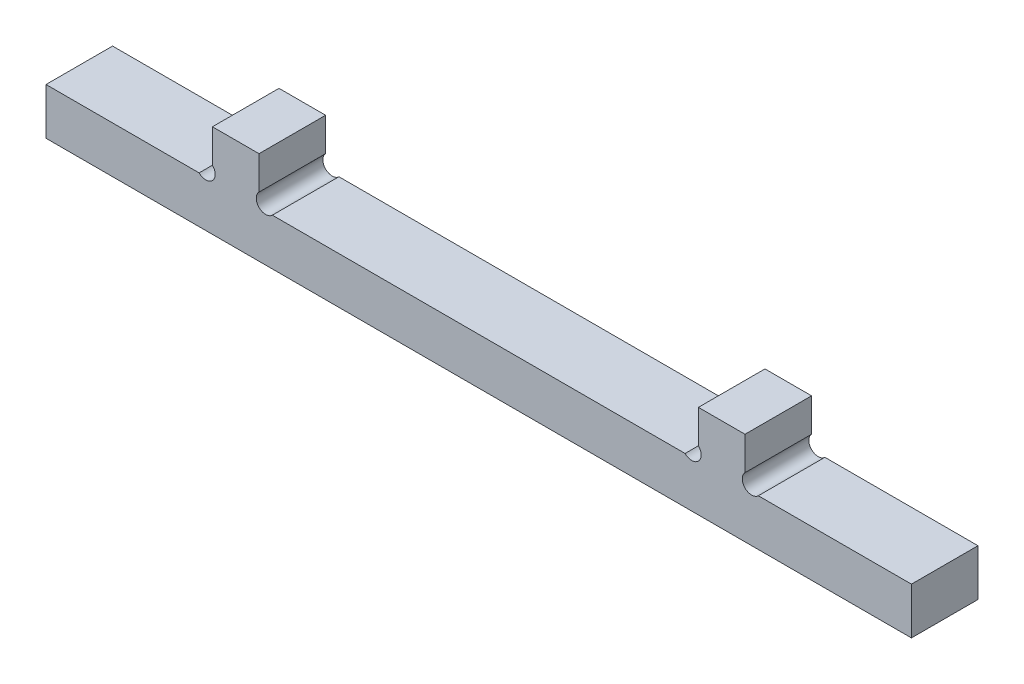
ISO-10303-21;
HEADER;
FILE_DESCRIPTION(('STEP AP214'),'2;1');
FILE_NAME('part.step','',(''),(''),'','','');
FILE_SCHEMA(('AUTOMOTIVE_DESIGN { 1 0 10303 214 1 1 1 1 }'));
ENDSEC;
DATA;
#1=APPLICATION_CONTEXT('core data for automotive mechanical design processes');
#2=APPLICATION_PROTOCOL_DEFINITION('international standard','automotive_design',2000,#1);
#3=PRODUCT_CONTEXT('',#1,'mechanical');
#4=PRODUCT('Part','Part','',(#3));
#5=PRODUCT_RELATED_PRODUCT_CATEGORY('part','',(#4));
#6=PRODUCT_DEFINITION_FORMATION('','',#4);
#7=PRODUCT_DEFINITION_CONTEXT('part definition',#1,'design');
#8=PRODUCT_DEFINITION('design','',#6,#7);
#9=PRODUCT_DEFINITION_SHAPE('','',#8);
#10=(LENGTH_UNIT() NAMED_UNIT(*) SI_UNIT(.MILLI.,.METRE.));
#11=(NAMED_UNIT(*) PLANE_ANGLE_UNIT() SI_UNIT($,.RADIAN.));
#12=(NAMED_UNIT(*) SI_UNIT($,.STERADIAN.) SOLID_ANGLE_UNIT());
#13=UNCERTAINTY_MEASURE_WITH_UNIT(LENGTH_MEASURE(1.E-05),#10,'distance_accuracy_value','');
#14=(GEOMETRIC_REPRESENTATION_CONTEXT(3) GLOBAL_UNCERTAINTY_ASSIGNED_CONTEXT((#13)) GLOBAL_UNIT_ASSIGNED_CONTEXT((#10,
#11,#12)) REPRESENTATION_CONTEXT('',''));
#15=CARTESIAN_POINT('',(0.,0.,0.));
#16=DIRECTION('',(0.,0.,1.));
#17=DIRECTION('',(1.,0.,0.));
#18=AXIS2_PLACEMENT_3D('',#15,#16,#17);
#19=CARTESIAN_POINT('',(52.0699999999999,5.71499999999943,12.7));
#20=DIRECTION('',(0.,0.,-1.));
#21=DIRECTION('',(-1.,0.,0.));
#22=AXIS2_PLACEMENT_3D('',#19,#20,#21);
#23=CYLINDRICAL_SURFACE('',#22,1.79605122421382);
#24=CARTESIAN_POINT('',(52.0699999999999,5.71499999999943,0.));
#25=DIRECTION('',(0.,0.,1.));
#26=DIRECTION('',(1.,0.,0.));
#27=AXIS2_PLACEMENT_3D('',#24,#25,#26);
#28=CIRCLE('',#27,1.79605122421382);
#29=CARTESIAN_POINT('',(50.8,6.98499999999947,0.));
#30=VERTEX_POINT('',#29);
#31=CARTESIAN_POINT('',(53.3400000000005,4.445,0.));
#32=VERTEX_POINT('',#31);
#33=EDGE_CURVE('E195',#30,#32,#28,.T.);
#34=ORIENTED_EDGE('',*,*,#33,.F.);
#35=DIRECTION('',(0.,0.,-1.));
#36=VECTOR('',#35,1.);
#37=CARTESIAN_POINT('',(50.8,6.98499999999947,12.7));
#38=LINE('',#37,#36);
#39=CARTESIAN_POINT('',(50.8,6.98499999999947,12.7));
#40=VERTEX_POINT('',#39);
#41=EDGE_CURVE('E11',#40,#30,#38,.T.);
#42=ORIENTED_EDGE('',*,*,#41,.F.);
#43=CARTESIAN_POINT('',(52.0699999999999,5.71499999999943,12.7));
#44=DIRECTION('',(0.,0.,1.));
#45=DIRECTION('',(1.,0.,0.));
#46=AXIS2_PLACEMENT_3D('',#43,#44,#45);
#47=CIRCLE('',#46,1.79605122421382);
#48=CARTESIAN_POINT('',(53.3400000000005,4.445,12.7));
#49=VERTEX_POINT('',#48);
#50=EDGE_CURVE('E351',#40,#49,#47,.T.);
#51=ORIENTED_EDGE('',*,*,#50,.T.);
#52=DIRECTION('',(0.,0.,-1.));
#53=VECTOR('',#52,1.);
#54=CARTESIAN_POINT('',(53.3400000000005,4.445,12.7));
#55=LINE('',#54,#53);
#56=EDGE_CURVE('E62',#49,#32,#55,.T.);
#57=ORIENTED_EDGE('',*,*,#56,.T.);
#58=EDGE_LOOP('',(#34,#42,#51,#57));
#59=FACE_BOUND('',#58,.T.);
#60=ADVANCED_FACE('F45',(#59),#23,.F.);
#61=CARTESIAN_POINT('',(50.8,0.,12.7));
#62=DIRECTION('',(-1.,0.,0.));
#63=DIRECTION('',(0.,0.,1.));
#64=AXIS2_PLACEMENT_3D('',#61,#62,#63);
#65=PLANE('',#64);
#66=DIRECTION('',(0.,1.,0.));
#67=VECTOR('',#66,1.);
#68=CARTESIAN_POINT('',(50.8,0.,0.));
#69=LINE('',#68,#67);
#70=CARTESIAN_POINT('',(50.8,13.335,0.));
#71=VERTEX_POINT('',#70);
#72=EDGE_CURVE('E198',#30,#71,#69,.T.);
#73=ORIENTED_EDGE('',*,*,#72,.T.);
#74=DIRECTION('',(0.,0.,-1.));
#75=VECTOR('',#74,1.);
#76=CARTESIAN_POINT('',(50.8,13.335,12.7));
#77=LINE('',#76,#75);
#78=CARTESIAN_POINT('',(50.8,13.335,12.7));
#79=VERTEX_POINT('',#78);
#80=EDGE_CURVE('E54',#79,#71,#77,.T.);
#81=ORIENTED_EDGE('',*,*,#80,.F.);
#82=DIRECTION('',(0.,1.,0.));
#83=VECTOR('',#82,1.);
#84=CARTESIAN_POINT('',(50.8,0.,12.7));
#85=LINE('',#84,#83);
#86=EDGE_CURVE('E309',#40,#79,#85,.T.);
#87=ORIENTED_EDGE('',*,*,#86,.F.);
#88=ORIENTED_EDGE('',*,*,#41,.T.);
#89=EDGE_LOOP('',(#73,#81,#87,#88));
#90=FACE_BOUND('',#89,.T.);
#91=ADVANCED_FACE('F355',(#90),#65,.F.);
#92=CARTESIAN_POINT('',(0.,13.335,12.7));
#93=DIRECTION('',(0.,-1.,0.));
#94=DIRECTION('',(1.,0.,0.));
#95=AXIS2_PLACEMENT_3D('',#92,#93,#94);
#96=PLANE('',#95);
#97=DIRECTION('',(-1.,0.,0.));
#98=VECTOR('',#97,1.);
#99=CARTESIAN_POINT('',(0.,13.335,0.));
#100=LINE('',#99,#98);
#101=CARTESIAN_POINT('',(41.91,13.335,0.));
#102=VERTEX_POINT('',#101);
#103=EDGE_CURVE('E201',#71,#102,#100,.T.);
#104=ORIENTED_EDGE('',*,*,#103,.T.);
#105=DIRECTION('',(0.,0.,-1.));
#106=VECTOR('',#105,1.);
#107=CARTESIAN_POINT('',(41.91,13.335,12.7));
#108=LINE('',#107,#106);
#109=CARTESIAN_POINT('',(41.91,13.335,12.7));
#110=VERTEX_POINT('',#109);
#111=EDGE_CURVE('E280',#110,#102,#108,.T.);
#112=ORIENTED_EDGE('',*,*,#111,.F.);
#113=DIRECTION('',(-1.,0.,0.));
#114=VECTOR('',#113,1.);
#115=CARTESIAN_POINT('',(0.,13.335,12.7));
#116=LINE('',#115,#114);
#117=EDGE_CURVE('E290',#79,#110,#116,.T.);
#118=ORIENTED_EDGE('',*,*,#117,.F.);
#119=ORIENTED_EDGE('',*,*,#80,.T.);
#120=EDGE_LOOP('',(#104,#112,#118,#119));
#121=FACE_BOUND('',#120,.T.);
#122=ADVANCED_FACE('F288',(#121),#96,.F.);
#123=CARTESIAN_POINT('',(41.91,0.,12.7));
#124=DIRECTION('',(-1.,0.,0.));
#125=DIRECTION('',(0.,0.,1.));
#126=AXIS2_PLACEMENT_3D('',#123,#124,#125);
#127=PLANE('',#126);
#128=DIRECTION('',(0.,1.,0.));
#129=VECTOR('',#128,1.);
#130=CARTESIAN_POINT('',(41.91,0.,0.));
#131=LINE('',#130,#129);
#132=CARTESIAN_POINT('',(41.91,6.98499999999953,0.));
#133=VERTEX_POINT('',#132);
#134=EDGE_CURVE('E205',#133,#102,#131,.T.);
#135=ORIENTED_EDGE('',*,*,#134,.F.);
#136=DIRECTION('',(0.,0.,-1.));
#137=VECTOR('',#136,1.);
#138=CARTESIAN_POINT('',(41.91,6.98499999999953,12.7));
#139=LINE('',#138,#137);
#140=CARTESIAN_POINT('',(41.91,6.98499999999953,12.7));
#141=VERTEX_POINT('',#140);
#142=EDGE_CURVE('E277',#141,#133,#139,.T.);
#143=ORIENTED_EDGE('',*,*,#142,.F.);
#144=DIRECTION('',(0.,1.,0.));
#145=VECTOR('',#144,1.);
#146=CARTESIAN_POINT('',(41.91,0.,12.7));
#147=LINE('',#146,#145);
#148=EDGE_CURVE('E302',#141,#110,#147,.T.);
#149=ORIENTED_EDGE('',*,*,#148,.T.);
#150=ORIENTED_EDGE('',*,*,#111,.T.);
#151=EDGE_LOOP('',(#135,#143,#149,#150));
#152=FACE_BOUND('',#151,.T.);
#153=ADVANCED_FACE('F298',(#152),#127,.T.);
#154=CARTESIAN_POINT('',(40.64,5.71499999999956,12.7));
#155=DIRECTION('',(0.,0.,-1.));
#156=DIRECTION('',(-1.,0.,0.));
#157=AXIS2_PLACEMENT_3D('',#154,#155,#156);
#158=CYLINDRICAL_SURFACE('',#157,1.79605122421383);
#159=CARTESIAN_POINT('',(40.64,5.71499999999956,0.));
#160=DIRECTION('',(0.,0.,1.));
#161=DIRECTION('',(1.,0.,0.));
#162=AXIS2_PLACEMENT_3D('',#159,#160,#161);
#163=CIRCLE('',#162,1.79605122421383);
#164=CARTESIAN_POINT('',(39.3699999999995,4.445,0.));
#165=VERTEX_POINT('',#164);
#166=EDGE_CURVE('E209',#133,#165,#163,.F.);
#167=ORIENTED_EDGE('',*,*,#166,.T.);
#168=DIRECTION('',(0.,0.,-1.));
#169=VECTOR('',#168,1.);
#170=CARTESIAN_POINT('',(39.3699999999995,4.445,12.7));
#171=LINE('',#170,#169);
#172=CARTESIAN_POINT('',(39.3699999999995,4.445,12.7));
#173=VERTEX_POINT('',#172);
#174=EDGE_CURVE('E274',#173,#165,#171,.T.);
#175=ORIENTED_EDGE('',*,*,#174,.F.);
#176=CARTESIAN_POINT('',(40.64,5.71499999999956,12.7));
#177=DIRECTION('',(0.,0.,1.));
#178=DIRECTION('',(1.,0.,0.));
#179=AXIS2_PLACEMENT_3D('',#176,#177,#178);
#180=CIRCLE('',#179,1.79605122421383);
#181=EDGE_CURVE('E304',#141,#173,#180,.F.);
#182=ORIENTED_EDGE('',*,*,#181,.F.);
#183=ORIENTED_EDGE('',*,*,#142,.T.);
#184=EDGE_LOOP('',(#167,#175,#182,#183));
#185=FACE_BOUND('',#184,.T.);
#186=ADVANCED_FACE('F365',(#185),#158,.F.);
#187=CARTESIAN_POINT('',(0.,4.445,12.7));
#188=DIRECTION('',(0.,1.,0.));
#189=DIRECTION('',(0.,0.,1.));
#190=AXIS2_PLACEMENT_3D('',#187,#188,#189);
#191=PLANE('',#190);
#192=DIRECTION('',(1.,0.,0.));
#193=VECTOR('',#192,1.);
#194=CARTESIAN_POINT('',(0.,4.445,0.));
#195=LINE('',#194,#193);
#196=CARTESIAN_POINT('',(-39.37,4.445,0.));
#197=VERTEX_POINT('',#196);
#198=EDGE_CURVE('E213',#197,#165,#195,.T.);
#199=ORIENTED_EDGE('',*,*,#198,.F.);
#200=DIRECTION('',(0.,0.,-1.));
#201=VECTOR('',#200,1.);
#202=CARTESIAN_POINT('',(-39.37,4.445,12.7));
#203=LINE('',#202,#201);
#204=CARTESIAN_POINT('',(-39.37,4.445,12.7));
#205=VERTEX_POINT('',#204);
#206=EDGE_CURVE('E271',#205,#197,#203,.T.);
#207=ORIENTED_EDGE('',*,*,#206,.F.);
#208=DIRECTION('',(1.,0.,0.));
#209=VECTOR('',#208,1.);
#210=CARTESIAN_POINT('',(0.,4.445,12.7));
#211=LINE('',#210,#209);
#212=EDGE_CURVE('E192',#205,#173,#211,.T.);
#213=ORIENTED_EDGE('',*,*,#212,.T.);
#214=ORIENTED_EDGE('',*,*,#174,.T.);
#215=EDGE_LOOP('',(#199,#207,#213,#214));
#216=FACE_BOUND('',#215,.T.);
#217=ADVANCED_FACE('F368',(#216),#191,.T.);
#218=CARTESIAN_POINT('',(-40.64,5.715,12.7));
#219=DIRECTION('',(0.,0.,-1.));
#220=DIRECTION('',(-1.,0.,0.));
#221=AXIS2_PLACEMENT_3D('',#218,#219,#220);
#222=CYLINDRICAL_SURFACE('',#221,1.79605122421383);
#223=CARTESIAN_POINT('',(-40.64,5.715,0.));
#224=DIRECTION('',(0.,0.,1.));
#225=DIRECTION('',(1.,0.,0.));
#226=AXIS2_PLACEMENT_3D('',#223,#224,#225);
#227=CIRCLE('',#226,1.79605122421383);
#228=CARTESIAN_POINT('',(-41.91,6.98500000000001,0.));
#229=VERTEX_POINT('',#228);
#230=EDGE_CURVE('E217',#229,#197,#227,.T.);
#231=ORIENTED_EDGE('',*,*,#230,.F.);
#232=DIRECTION('',(0.,0.,-1.));
#233=VECTOR('',#232,1.);
#234=CARTESIAN_POINT('',(-41.91,6.98500000000001,12.7));
#235=LINE('',#234,#233);
#236=CARTESIAN_POINT('',(-41.91,6.98500000000001,12.7));
#237=VERTEX_POINT('',#236);
#238=EDGE_CURVE('E268',#237,#229,#235,.T.);
#239=ORIENTED_EDGE('',*,*,#238,.F.);
#240=CARTESIAN_POINT('',(-40.64,5.715,12.7));
#241=DIRECTION('',(0.,0.,1.));
#242=DIRECTION('',(1.,0.,0.));
#243=AXIS2_PLACEMENT_3D('',#240,#241,#242);
#244=CIRCLE('',#243,1.79605122421383);
#245=EDGE_CURVE('E315',#237,#205,#244,.T.);
#246=ORIENTED_EDGE('',*,*,#245,.T.);
#247=ORIENTED_EDGE('',*,*,#206,.T.);
#248=EDGE_LOOP('',(#231,#239,#246,#247));
#249=FACE_BOUND('',#248,.T.);
#250=ADVANCED_FACE('F370',(#249),#222,.F.);
#251=CARTESIAN_POINT('',(-41.91,0.,12.7));
#252=DIRECTION('',(-1.,0.,0.));
#253=DIRECTION('',(0.,0.,1.));
#254=AXIS2_PLACEMENT_3D('',#251,#252,#253);
#255=PLANE('',#254);
#256=DIRECTION('',(0.,1.,0.));
#257=VECTOR('',#256,1.);
#258=CARTESIAN_POINT('',(-41.91,0.,0.));
#259=LINE('',#258,#257);
#260=CARTESIAN_POINT('',(-41.91,13.335,0.));
#261=VERTEX_POINT('',#260);
#262=EDGE_CURVE('E223',#229,#261,#259,.T.);
#263=ORIENTED_EDGE('',*,*,#262,.T.);
#264=DIRECTION('',(0.,0.,-1.));
#265=VECTOR('',#264,1.);
#266=CARTESIAN_POINT('',(-41.91,13.335,12.7));
#267=LINE('',#266,#265);
#268=CARTESIAN_POINT('',(-41.91,13.335,12.7));
#269=VERTEX_POINT('',#268);
#270=EDGE_CURVE('E265',#269,#261,#267,.T.);
#271=ORIENTED_EDGE('',*,*,#270,.F.);
#272=DIRECTION('',(0.,1.,0.));
#273=VECTOR('',#272,1.);
#274=CARTESIAN_POINT('',(-41.91,0.,12.7));
#275=LINE('',#274,#273);
#276=EDGE_CURVE('E319',#237,#269,#275,.T.);
#277=ORIENTED_EDGE('',*,*,#276,.F.);
#278=ORIENTED_EDGE('',*,*,#238,.T.);
#279=EDGE_LOOP('',(#263,#271,#277,#278));
#280=FACE_BOUND('',#279,.T.);
#281=ADVANCED_FACE('F373',(#280),#255,.F.);
#282=CARTESIAN_POINT('',(0.,13.335,12.7));
#283=DIRECTION('',(0.,1.,0.));
#284=DIRECTION('',(-1.,0.,0.));
#285=AXIS2_PLACEMENT_3D('',#282,#283,#284);
#286=PLANE('',#285);
#287=DIRECTION('',(1.,0.,0.));
#288=VECTOR('',#287,1.);
#289=CARTESIAN_POINT('',(0.,13.335,0.));
#290=LINE('',#289,#288);
#291=CARTESIAN_POINT('',(-50.8,13.335,0.));
#292=VERTEX_POINT('',#291);
#293=EDGE_CURVE('E227',#292,#261,#290,.T.);
#294=ORIENTED_EDGE('',*,*,#293,.F.);
#295=DIRECTION('',(0.,0.,-1.));
#296=VECTOR('',#295,1.);
#297=CARTESIAN_POINT('',(-50.8,13.335,12.7));
#298=LINE('',#297,#296);
#299=CARTESIAN_POINT('',(-50.8,13.335,12.7));
#300=VERTEX_POINT('',#299);
#301=EDGE_CURVE('E262',#300,#292,#298,.T.);
#302=ORIENTED_EDGE('',*,*,#301,.F.);
#303=DIRECTION('',(1.,0.,0.));
#304=VECTOR('',#303,1.);
#305=CARTESIAN_POINT('',(0.,13.335,12.7));
#306=LINE('',#305,#304);
#307=EDGE_CURVE('E322',#300,#269,#306,.T.);
#308=ORIENTED_EDGE('',*,*,#307,.T.);
#309=ORIENTED_EDGE('',*,*,#270,.T.);
#310=EDGE_LOOP('',(#294,#302,#308,#309));
#311=FACE_BOUND('',#310,.T.);
#312=ADVANCED_FACE('F377',(#311),#286,.T.);
#313=CARTESIAN_POINT('',(-50.8,0.,12.7));
#314=DIRECTION('',(-1.,0.,0.));
#315=DIRECTION('',(0.,0.,1.));
#316=AXIS2_PLACEMENT_3D('',#313,#314,#315);
#317=PLANE('',#316);
#318=DIRECTION('',(0.,1.,0.));
#319=VECTOR('',#318,1.);
#320=CARTESIAN_POINT('',(-50.8,0.,0.));
#321=LINE('',#320,#319);
#322=CARTESIAN_POINT('',(-50.8,6.98500000000001,0.));
#323=VERTEX_POINT('',#322);
#324=EDGE_CURVE('E231',#323,#292,#321,.T.);
#325=ORIENTED_EDGE('',*,*,#324,.F.);
#326=DIRECTION('',(0.,0.,-1.));
#327=VECTOR('',#326,1.);
#328=CARTESIAN_POINT('',(-50.8,6.98500000000001,12.7));
#329=LINE('',#328,#327);
#330=CARTESIAN_POINT('',(-50.8,6.98500000000001,12.7));
#331=VERTEX_POINT('',#330);
#332=EDGE_CURVE('E259',#331,#323,#329,.T.);
#333=ORIENTED_EDGE('',*,*,#332,.F.);
#334=DIRECTION('',(0.,1.,0.));
#335=VECTOR('',#334,1.);
#336=CARTESIAN_POINT('',(-50.8,0.,12.7));
#337=LINE('',#336,#335);
#338=EDGE_CURVE('E326',#331,#300,#337,.T.);
#339=ORIENTED_EDGE('',*,*,#338,.T.);
#340=ORIENTED_EDGE('',*,*,#301,.T.);
#341=EDGE_LOOP('',(#325,#333,#339,#340));
#342=FACE_BOUND('',#341,.T.);
#343=ADVANCED_FACE('F381',(#342),#317,.T.);
#344=CARTESIAN_POINT('',(-52.07,5.715,12.7));
#345=DIRECTION('',(0.,0.,-1.));
#346=DIRECTION('',(-1.,0.,0.));
#347=AXIS2_PLACEMENT_3D('',#344,#345,#346);
#348=CYLINDRICAL_SURFACE('',#347,1.79605122421383);
#349=CARTESIAN_POINT('',(-52.07,5.715,0.));
#350=DIRECTION('',(0.,0.,1.));
#351=DIRECTION('',(1.,0.,0.));
#352=AXIS2_PLACEMENT_3D('',#349,#350,#351);
#353=CIRCLE('',#352,1.79605122421383);
#354=CARTESIAN_POINT('',(-53.34,4.445,0.));
#355=VERTEX_POINT('',#354);
#356=EDGE_CURVE('E235',#323,#355,#353,.F.);
#357=ORIENTED_EDGE('',*,*,#356,.T.);
#358=DIRECTION('',(0.,0.,-1.));
#359=VECTOR('',#358,1.);
#360=CARTESIAN_POINT('',(-53.34,4.445,12.7));
#361=LINE('',#360,#359);
#362=CARTESIAN_POINT('',(-53.34,4.445,12.7));
#363=VERTEX_POINT('',#362);
#364=EDGE_CURVE('E256',#363,#355,#361,.T.);
#365=ORIENTED_EDGE('',*,*,#364,.F.);
#366=CARTESIAN_POINT('',(-52.07,5.715,12.7));
#367=DIRECTION('',(0.,0.,1.));
#368=DIRECTION('',(1.,0.,0.));
#369=AXIS2_PLACEMENT_3D('',#366,#367,#368);
#370=CIRCLE('',#369,1.79605122421383);
#371=EDGE_CURVE('E330',#331,#363,#370,.F.);
#372=ORIENTED_EDGE('',*,*,#371,.F.);
#373=ORIENTED_EDGE('',*,*,#332,.T.);
#374=EDGE_LOOP('',(#357,#365,#372,#373));
#375=FACE_BOUND('',#374,.T.);
#376=ADVANCED_FACE('F343',(#375),#348,.F.);
#377=CARTESIAN_POINT('',(-82.55,4.445,0.));
#378=VERTEX_POINT('',#377);
#379=EDGE_CURVE('E219',#378,#355,#195,.T.);
#380=ORIENTED_EDGE('',*,*,#379,.F.);
#381=DIRECTION('',(0.,0.,-1.));
#382=VECTOR('',#381,1.);
#383=CARTESIAN_POINT('',(-82.55,4.445,12.7));
#384=LINE('',#383,#382);
#385=CARTESIAN_POINT('',(-82.55,4.445,12.7));
#386=VERTEX_POINT('',#385);
#387=EDGE_CURVE('E253',#386,#378,#384,.T.);
#388=ORIENTED_EDGE('',*,*,#387,.F.);
#389=EDGE_CURVE('E191',#386,#363,#211,.T.);
#390=ORIENTED_EDGE('',*,*,#389,.T.);
#391=ORIENTED_EDGE('',*,*,#364,.T.);
#392=EDGE_LOOP('',(#380,#388,#390,#391));
#393=FACE_BOUND('',#392,.T.);
#394=ADVANCED_FACE('F337',(#393),#191,.T.);
#395=CARTESIAN_POINT('',(-82.55,0.,12.7));
#396=DIRECTION('',(1.,0.,0.));
#397=DIRECTION('',(0.,0.,-1.));
#398=AXIS2_PLACEMENT_3D('',#395,#396,#397);
#399=PLANE('',#398);
#400=DIRECTION('',(0.,-1.,0.));
#401=VECTOR('',#400,1.);
#402=CARTESIAN_POINT('',(-82.55,0.,0.));
#403=LINE('',#402,#401);
#404=CARTESIAN_POINT('',(-82.55,-4.445,0.));
#405=VERTEX_POINT('',#404);
#406=EDGE_CURVE('E239',#378,#405,#403,.T.);
#407=ORIENTED_EDGE('',*,*,#406,.T.);
#408=DIRECTION('',(0.,0.,-1.));
#409=VECTOR('',#408,1.);
#410=CARTESIAN_POINT('',(-82.55,-4.445,12.7));
#411=LINE('',#410,#409);
#412=CARTESIAN_POINT('',(-82.55,-4.445,12.7));
#413=VERTEX_POINT('',#412);
#414=EDGE_CURVE('E183',#413,#405,#411,.T.);
#415=ORIENTED_EDGE('',*,*,#414,.F.);
#416=DIRECTION('',(0.,-1.,0.));
#417=VECTOR('',#416,1.);
#418=CARTESIAN_POINT('',(-82.55,0.,12.7));
#419=LINE('',#418,#417);
#420=EDGE_CURVE('E169',#386,#413,#419,.T.);
#421=ORIENTED_EDGE('',*,*,#420,.F.);
#422=ORIENTED_EDGE('',*,*,#387,.T.);
#423=EDGE_LOOP('',(#407,#415,#421,#422));
#424=FACE_BOUND('',#423,.T.);
#425=ADVANCED_FACE('F388',(#424),#399,.F.);
#426=CARTESIAN_POINT('',(0.,-4.445,12.7));
#427=DIRECTION('',(0.,1.,0.));
#428=DIRECTION('',(0.,0.,1.));
#429=AXIS2_PLACEMENT_3D('',#426,#427,#428);
#430=PLANE('',#429);
#431=DIRECTION('',(1.,0.,0.));
#432=VECTOR('',#431,1.);
#433=CARTESIAN_POINT('',(0.,-4.445,0.));
#434=LINE('',#433,#432);
#435=CARTESIAN_POINT('',(82.55,-4.445,0.));
#436=VERTEX_POINT('',#435);
#437=EDGE_CURVE('E179',#405,#436,#434,.T.);
#438=ORIENTED_EDGE('',*,*,#437,.T.);
#439=DIRECTION('',(0.,0.,-1.));
#440=VECTOR('',#439,1.);
#441=CARTESIAN_POINT('',(82.55,-4.445,12.7));
#442=LINE('',#441,#440);
#443=CARTESIAN_POINT('',(82.55,-4.445,12.7));
#444=VERTEX_POINT('',#443);
#445=EDGE_CURVE('E176',#444,#436,#442,.T.);
#446=ORIENTED_EDGE('',*,*,#445,.F.);
#447=DIRECTION('',(1.,0.,0.));
#448=VECTOR('',#447,1.);
#449=CARTESIAN_POINT('',(0.,-4.445,12.7));
#450=LINE('',#449,#448);
#451=EDGE_CURVE('E160',#413,#444,#450,.T.);
#452=ORIENTED_EDGE('',*,*,#451,.F.);
#453=ORIENTED_EDGE('',*,*,#414,.T.);
#454=EDGE_LOOP('',(#438,#446,#452,#453));
#455=FACE_BOUND('',#454,.T.);
#456=ADVANCED_FACE('F177',(#455),#430,.F.);
#457=CARTESIAN_POINT('',(82.55,0.,12.7));
#458=DIRECTION('',(1.,0.,0.));
#459=DIRECTION('',(0.,0.,-1.));
#460=AXIS2_PLACEMENT_3D('',#457,#458,#459);
#461=PLANE('',#460);
#462=DIRECTION('',(0.,-1.,0.));
#463=VECTOR('',#462,1.);
#464=CARTESIAN_POINT('',(82.55,0.,0.));
#465=LINE('',#464,#463);
#466=CARTESIAN_POINT('',(82.55,4.445,0.));
#467=VERTEX_POINT('',#466);
#468=EDGE_CURVE('E244',#467,#436,#465,.T.);
#469=ORIENTED_EDGE('',*,*,#468,.F.);
#470=DIRECTION('',(0.,0.,-1.));
#471=VECTOR('',#470,1.);
#472=CARTESIAN_POINT('',(82.55,4.445,12.7));
#473=LINE('',#472,#471);
#474=CARTESIAN_POINT('',(82.55,4.445,12.7));
#475=VERTEX_POINT('',#474);
#476=EDGE_CURVE('E111',#475,#467,#473,.T.);
#477=ORIENTED_EDGE('',*,*,#476,.F.);
#478=DIRECTION('',(0.,-1.,0.));
#479=VECTOR('',#478,1.);
#480=CARTESIAN_POINT('',(82.55,0.,12.7));
#481=LINE('',#480,#479);
#482=EDGE_CURVE('E166',#475,#444,#481,.T.);
#483=ORIENTED_EDGE('',*,*,#482,.T.);
#484=ORIENTED_EDGE('',*,*,#445,.T.);
#485=EDGE_LOOP('',(#469,#477,#483,#484));
#486=FACE_BOUND('',#485,.T.);
#487=ADVANCED_FACE('F185',(#486),#461,.T.);
#488=EDGE_CURVE('E218',#32,#467,#195,.T.);
#489=ORIENTED_EDGE('',*,*,#488,.F.);
#490=ORIENTED_EDGE('',*,*,#56,.F.);
#491=EDGE_CURVE('E187',#49,#475,#211,.T.);
#492=ORIENTED_EDGE('',*,*,#491,.T.);
#493=ORIENTED_EDGE('',*,*,#476,.T.);
#494=EDGE_LOOP('',(#489,#490,#492,#493));
#495=FACE_BOUND('',#494,.T.);
#496=ADVANCED_FACE('F396',(#495),#191,.T.);
#497=CARTESIAN_POINT('',(0.,0.,12.7));
#498=DIRECTION('',(0.,0.,1.));
#499=DIRECTION('',(1.,0.,0.));
#500=AXIS2_PLACEMENT_3D('',#497,#498,#499);
#501=PLANE('',#500);
#502=ORIENTED_EDGE('',*,*,#50,.F.);
#503=ORIENTED_EDGE('',*,*,#86,.T.);
#504=ORIENTED_EDGE('',*,*,#117,.T.);
#505=ORIENTED_EDGE('',*,*,#148,.F.);
#506=ORIENTED_EDGE('',*,*,#181,.T.);
#507=ORIENTED_EDGE('',*,*,#212,.F.);
#508=ORIENTED_EDGE('',*,*,#245,.F.);
#509=ORIENTED_EDGE('',*,*,#276,.T.);
#510=ORIENTED_EDGE('',*,*,#307,.F.);
#511=ORIENTED_EDGE('',*,*,#338,.F.);
#512=ORIENTED_EDGE('',*,*,#371,.T.);
#513=ORIENTED_EDGE('',*,*,#389,.F.);
#514=ORIENTED_EDGE('',*,*,#420,.T.);
#515=ORIENTED_EDGE('',*,*,#451,.T.);
#516=ORIENTED_EDGE('',*,*,#482,.F.);
#517=ORIENTED_EDGE('',*,*,#491,.F.);
#518=EDGE_LOOP('',(#502,#503,#504,#505,#506,#507,#508,#509,#510,#511,#512,#513,#514,#515,#516,#517));
#519=FACE_BOUND('',#518,.T.);
#520=ADVANCED_FACE('F163',(#519),#501,.T.);
#521=CARTESIAN_POINT('',(0.,0.,0.));
#522=DIRECTION('',(0.,0.,1.));
#523=DIRECTION('',(1.,0.,0.));
#524=AXIS2_PLACEMENT_3D('',#521,#522,#523);
#525=PLANE('',#524);
#526=ORIENTED_EDGE('',*,*,#33,.T.);
#527=ORIENTED_EDGE('',*,*,#488,.T.);
#528=ORIENTED_EDGE('',*,*,#468,.T.);
#529=ORIENTED_EDGE('',*,*,#437,.F.);
#530=ORIENTED_EDGE('',*,*,#406,.F.);
#531=ORIENTED_EDGE('',*,*,#379,.T.);
#532=ORIENTED_EDGE('',*,*,#356,.F.);
#533=ORIENTED_EDGE('',*,*,#324,.T.);
#534=ORIENTED_EDGE('',*,*,#293,.T.);
#535=ORIENTED_EDGE('',*,*,#262,.F.);
#536=ORIENTED_EDGE('',*,*,#230,.T.);
#537=ORIENTED_EDGE('',*,*,#198,.T.);
#538=ORIENTED_EDGE('',*,*,#166,.F.);
#539=ORIENTED_EDGE('',*,*,#134,.T.);
#540=ORIENTED_EDGE('',*,*,#103,.F.);
#541=ORIENTED_EDGE('',*,*,#72,.F.);
#542=EDGE_LOOP('',(#526,#527,#528,#529,#530,#531,#532,#533,#534,#535,#536,#537,#538,#539,#540,#541));
#543=FACE_BOUND('',#542,.T.);
#544=ADVANCED_FACE('F294',(#543),#525,.F.);
#545=CLOSED_SHELL('',(#60,#91,#122,#153,#186,#217,#250,#281,#312,#343,#376,#394,#425,#456,#487,
#496,#520,#544));
#546=MANIFOLD_SOLID_BREP('B2',#545);
#547=ADVANCED_BREP_SHAPE_REPRESENTATION('',(#18,#546),#14);
#548=SHAPE_DEFINITION_REPRESENTATION(#9,#547);
ENDSEC;
END-ISO-10303-21;
